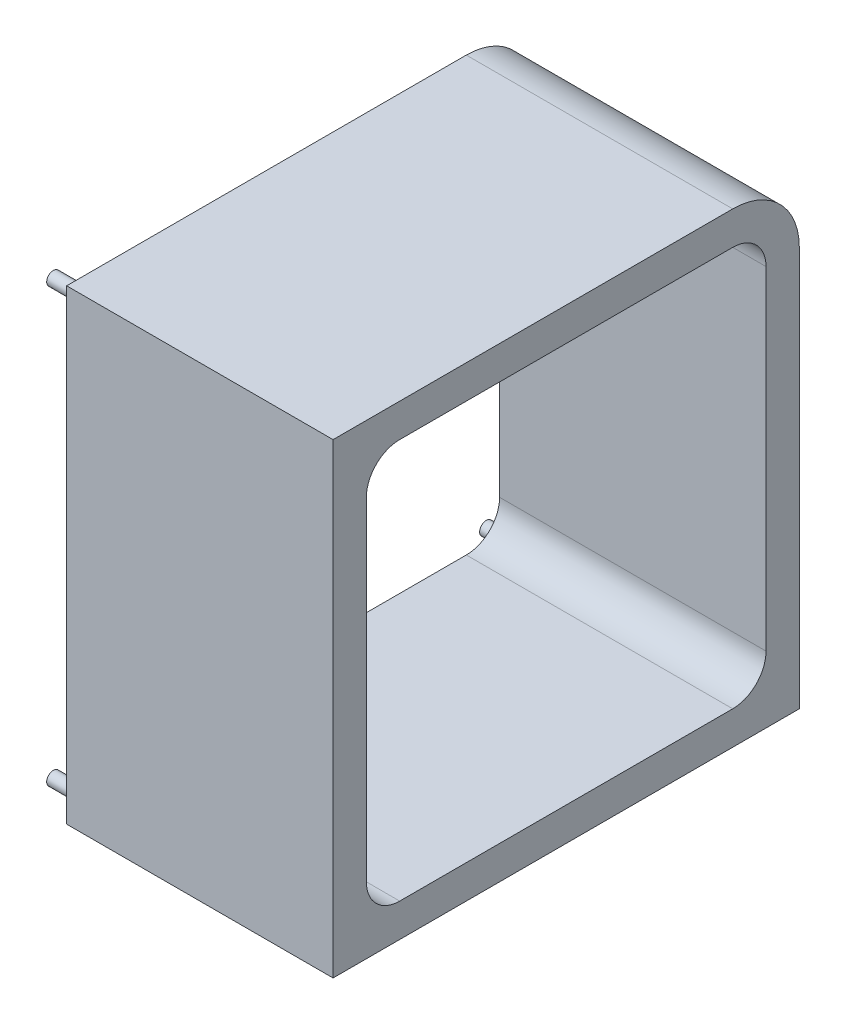
ISO-10303-21;
HEADER;
FILE_DESCRIPTION(('STEP AP214'),'2;1');
FILE_NAME('part.step','',(''),(''),'','','');
FILE_SCHEMA(('AUTOMOTIVE_DESIGN { 1 0 10303 214 1 1 1 1 }'));
ENDSEC;
DATA;
#1=APPLICATION_CONTEXT('core data for automotive mechanical design processes');
#2=APPLICATION_PROTOCOL_DEFINITION('international standard','automotive_design',2000,#1);
#3=PRODUCT_CONTEXT('',#1,'mechanical');
#4=PRODUCT('Part','Part','',(#3));
#5=PRODUCT_RELATED_PRODUCT_CATEGORY('part','',(#4));
#6=PRODUCT_DEFINITION_FORMATION('','',#4);
#7=PRODUCT_DEFINITION_CONTEXT('part definition',#1,'design');
#8=PRODUCT_DEFINITION('design','',#6,#7);
#9=PRODUCT_DEFINITION_SHAPE('','',#8);
#10=(LENGTH_UNIT() NAMED_UNIT(*) SI_UNIT(.MILLI.,.METRE.));
#11=(NAMED_UNIT(*) PLANE_ANGLE_UNIT() SI_UNIT($,.RADIAN.));
#12=(NAMED_UNIT(*) SI_UNIT($,.STERADIAN.) SOLID_ANGLE_UNIT());
#13=UNCERTAINTY_MEASURE_WITH_UNIT(LENGTH_MEASURE(1.E-05),#10,'distance_accuracy_value','');
#14=(GEOMETRIC_REPRESENTATION_CONTEXT(3) GLOBAL_UNCERTAINTY_ASSIGNED_CONTEXT((#13)) GLOBAL_UNIT_ASSIGNED_CONTEXT((#10,
#11,#12)) REPRESENTATION_CONTEXT('',''));
#15=CARTESIAN_POINT('',(0.,0.,0.));
#16=DIRECTION('',(0.,0.,1.));
#17=DIRECTION('',(1.,0.,0.));
#18=AXIS2_PLACEMENT_3D('',#15,#16,#17);
#19=CARTESIAN_POINT('',(80.,120.,-120.));
#20=DIRECTION('',(-1.,0.,0.));
#21=DIRECTION('',(0.,0.,1.));
#22=AXIS2_PLACEMENT_3D('',#19,#20,#21);
#23=PLANE('',#22);
#24=DIRECTION('',(0.,-1.,0.));
#25=VECTOR('',#24,1.);
#26=CARTESIAN_POINT('',(80.,0.,0.));
#27=LINE('',#26,#25);
#28=CARTESIAN_POINT('',(80.,140.,0.));
#29=VERTEX_POINT('',#28);
#30=CARTESIAN_POINT('',(80.,0.,0.));
#31=VERTEX_POINT('',#30);
#32=EDGE_CURVE('E226',#29,#31,#27,.T.);
#33=ORIENTED_EDGE('',*,*,#32,.T.);
#34=DIRECTION('',(0.,0.,-1.));
#35=VECTOR('',#34,1.);
#36=CARTESIAN_POINT('',(80.,0.,0.));
#37=LINE('',#36,#35);
#38=CARTESIAN_POINT('',(80.,0.,-140.));
#39=VERTEX_POINT('',#38);
#40=EDGE_CURVE('E230',#31,#39,#37,.T.);
#41=ORIENTED_EDGE('',*,*,#40,.T.);
#42=DIRECTION('',(0.,1.,0.));
#43=VECTOR('',#42,1.);
#44=CARTESIAN_POINT('',(80.,0.,-140.));
#45=LINE('',#44,#43);
#46=CARTESIAN_POINT('',(80.,120.,-140.));
#47=VERTEX_POINT('',#46);
#48=EDGE_CURVE('E234',#39,#47,#45,.T.);
#49=ORIENTED_EDGE('',*,*,#48,.T.);
#50=CARTESIAN_POINT('',(80.,120.,-120.));
#51=DIRECTION('',(1.,0.,0.));
#52=DIRECTION('',(0.,0.,1.));
#53=AXIS2_PLACEMENT_3D('',#50,#51,#52);
#54=CIRCLE('',#53,20.);
#55=CARTESIAN_POINT('',(80.,140.,-120.));
#56=VERTEX_POINT('',#55);
#57=EDGE_CURVE('E237',#47,#56,#54,.T.);
#58=ORIENTED_EDGE('',*,*,#57,.T.);
#59=DIRECTION('',(0.,0.,1.));
#60=VECTOR('',#59,1.);
#61=CARTESIAN_POINT('',(80.,140.,0.));
#62=LINE('',#61,#60);
#63=EDGE_CURVE('E240',#56,#29,#62,.T.);
#64=ORIENTED_EDGE('',*,*,#63,.T.);
#65=EDGE_LOOP('',(#33,#41,#49,#58,#64));
#66=FACE_BOUND('',#65,.T.);
#67=CARTESIAN_POINT('',(80.,20.,-120.));
#68=DIRECTION('',(1.,0.,0.));
#69=DIRECTION('',(0.,0.,-1.));
#70=AXIS2_PLACEMENT_3D('',#67,#68,#69);
#71=CIRCLE('',#70,10.);
#72=CARTESIAN_POINT('',(80.,10.,-120.));
#73=VERTEX_POINT('',#72);
#74=CARTESIAN_POINT('',(80.,20.0000000000001,-130.));
#75=VERTEX_POINT('',#74);
#76=EDGE_CURVE('E135',#73,#75,#71,.T.);
#77=ORIENTED_EDGE('',*,*,#76,.F.);
#78=DIRECTION('',(0.,0.,-1.));
#79=VECTOR('',#78,1.);
#80=CARTESIAN_POINT('',(80.,10.,-20.0000000000001));
#81=LINE('',#80,#79);
#82=CARTESIAN_POINT('',(80.,9.99999999999999,-20.0000000000001));
#83=VERTEX_POINT('',#82);
#84=EDGE_CURVE('E177',#83,#73,#81,.T.);
#85=ORIENTED_EDGE('',*,*,#84,.F.);
#86=CARTESIAN_POINT('',(80.,20.,-20.));
#87=DIRECTION('',(1.,0.,0.));
#88=DIRECTION('',(0.,0.,1.));
#89=AXIS2_PLACEMENT_3D('',#86,#87,#88);
#90=CIRCLE('',#89,10.);
#91=CARTESIAN_POINT('',(80.,20.,-10.));
#92=VERTEX_POINT('',#91);
#93=EDGE_CURVE('E174',#92,#83,#90,.T.);
#94=ORIENTED_EDGE('',*,*,#93,.F.);
#95=DIRECTION('',(0.,-1.,0.));
#96=VECTOR('',#95,1.);
#97=CARTESIAN_POINT('',(80.,120.,-10.));
#98=LINE('',#97,#96);
#99=CARTESIAN_POINT('',(80.,120.,-10.));
#100=VERTEX_POINT('',#99);
#101=EDGE_CURVE('E171',#100,#92,#98,.T.);
#102=ORIENTED_EDGE('',*,*,#101,.F.);
#103=CARTESIAN_POINT('',(80.,120.,-20.));
#104=DIRECTION('',(1.,0.,0.));
#105=DIRECTION('',(0.,0.,1.));
#106=AXIS2_PLACEMENT_3D('',#103,#104,#105);
#107=CIRCLE('',#106,10.);
#108=CARTESIAN_POINT('',(80.,130.,-20.0000000000001));
#109=VERTEX_POINT('',#108);
#110=EDGE_CURVE('E168',#109,#100,#107,.T.);
#111=ORIENTED_EDGE('',*,*,#110,.F.);
#112=DIRECTION('',(0.,0.,1.));
#113=VECTOR('',#112,1.);
#114=CARTESIAN_POINT('',(80.,130.,-20.0000000000001));
#115=LINE('',#114,#113);
#116=CARTESIAN_POINT('',(80.,130.,-120.));
#117=VERTEX_POINT('',#116);
#118=EDGE_CURVE('E162',#117,#109,#115,.T.);
#119=ORIENTED_EDGE('',*,*,#118,.F.);
#120=CARTESIAN_POINT('',(80.,120.,-120.));
#121=DIRECTION('',(1.,0.,0.));
#122=DIRECTION('',(0.,0.,-1.));
#123=AXIS2_PLACEMENT_3D('',#120,#121,#122);
#124=CIRCLE('',#123,9.99999999999999);
#125=CARTESIAN_POINT('',(80.,120.,-130.));
#126=VERTEX_POINT('',#125);
#127=EDGE_CURVE('E158',#126,#117,#124,.T.);
#128=ORIENTED_EDGE('',*,*,#127,.F.);
#129=DIRECTION('',(0.,1.,0.));
#130=VECTOR('',#129,1.);
#131=CARTESIAN_POINT('',(80.,120.,-130.));
#132=LINE('',#131,#130);
#133=EDGE_CURVE('E144',#75,#126,#132,.T.);
#134=ORIENTED_EDGE('',*,*,#133,.F.);
#135=EDGE_LOOP('',(#77,#85,#94,#102,#111,#119,#128,#134));
#136=FACE_BOUND('',#135,.T.);
#137=ADVANCED_FACE('F39',(#66,#136),#23,.F.);
#138=CARTESIAN_POINT('',(0.,120.,-120.));
#139=DIRECTION('',(-1.,0.,0.));
#140=DIRECTION('',(0.,0.,1.));
#141=AXIS2_PLACEMENT_3D('',#138,#139,#140);
#142=PLANE('',#141);
#143=CARTESIAN_POINT('',(0.,5.,-5.));
#144=DIRECTION('',(-1.,0.,0.));
#145=DIRECTION('',(0.,0.,1.));
#146=AXIS2_PLACEMENT_3D('',#143,#144,#145);
#147=CIRCLE('',#146,2.);
#148=CARTESIAN_POINT('',(0.,5.,-3.));
#149=VERTEX_POINT('',#148);
#150=EDGE_CURVE('E491',#149,#149,#147,.T.);
#151=ORIENTED_EDGE('',*,*,#150,.F.);
#152=EDGE_LOOP('',(#151));
#153=FACE_BOUND('',#152,.T.);
#154=CARTESIAN_POINT('',(0.,5.,-135.));
#155=DIRECTION('',(-1.,0.,0.));
#156=DIRECTION('',(0.,0.,1.));
#157=AXIS2_PLACEMENT_3D('',#154,#155,#156);
#158=CIRCLE('',#157,2.);
#159=CARTESIAN_POINT('',(0.,5.,-133.));
#160=VERTEX_POINT('',#159);
#161=EDGE_CURVE('E490',#160,#160,#158,.T.);
#162=ORIENTED_EDGE('',*,*,#161,.F.);
#163=EDGE_LOOP('',(#162));
#164=FACE_BOUND('',#163,.T.);
#165=CARTESIAN_POINT('',(0.,135.,-5.));
#166=DIRECTION('',(-1.,0.,0.));
#167=DIRECTION('',(0.,0.,1.));
#168=AXIS2_PLACEMENT_3D('',#165,#166,#167);
#169=CIRCLE('',#168,2.);
#170=CARTESIAN_POINT('',(0.,135.,-3.));
#171=VERTEX_POINT('',#170);
#172=EDGE_CURVE('E503',#171,#171,#169,.T.);
#173=ORIENTED_EDGE('',*,*,#172,.F.);
#174=EDGE_LOOP('',(#173));
#175=FACE_BOUND('',#174,.T.);
#176=DIRECTION('',(0.,-1.,0.));
#177=VECTOR('',#176,1.);
#178=CARTESIAN_POINT('',(0.,0.,0.));
#179=LINE('',#178,#177);
#180=CARTESIAN_POINT('',(0.,140.,0.));
#181=VERTEX_POINT('',#180);
#182=CARTESIAN_POINT('',(0.,0.,0.));
#183=VERTEX_POINT('',#182);
#184=EDGE_CURVE('E153',#181,#183,#179,.T.);
#185=ORIENTED_EDGE('',*,*,#184,.F.);
#186=DIRECTION('',(0.,0.,1.));
#187=VECTOR('',#186,1.);
#188=CARTESIAN_POINT('',(0.,140.,0.));
#189=LINE('',#188,#187);
#190=CARTESIAN_POINT('',(0.,140.,-120.));
#191=VERTEX_POINT('',#190);
#192=EDGE_CURVE('E231',#191,#181,#189,.T.);
#193=ORIENTED_EDGE('',*,*,#192,.F.);
#194=CARTESIAN_POINT('',(0.,120.,-120.));
#195=DIRECTION('',(1.,0.,0.));
#196=DIRECTION('',(0.,0.,1.));
#197=AXIS2_PLACEMENT_3D('',#194,#195,#196);
#198=CIRCLE('',#197,20.);
#199=CARTESIAN_POINT('',(0.,120.,-140.));
#200=VERTEX_POINT('',#199);
#201=EDGE_CURVE('E253',#200,#191,#198,.T.);
#202=ORIENTED_EDGE('',*,*,#201,.F.);
#203=DIRECTION('',(0.,1.,0.));
#204=VECTOR('',#203,1.);
#205=CARTESIAN_POINT('',(0.,0.,-140.));
#206=LINE('',#205,#204);
#207=CARTESIAN_POINT('',(0.,0.,-140.));
#208=VERTEX_POINT('',#207);
#209=EDGE_CURVE('E250',#208,#200,#206,.T.);
#210=ORIENTED_EDGE('',*,*,#209,.F.);
#211=DIRECTION('',(0.,0.,-1.));
#212=VECTOR('',#211,1.);
#213=CARTESIAN_POINT('',(0.,0.,0.));
#214=LINE('',#213,#212);
#215=EDGE_CURVE('E247',#183,#208,#214,.T.);
#216=ORIENTED_EDGE('',*,*,#215,.F.);
#217=EDGE_LOOP('',(#185,#193,#202,#210,#216));
#218=FACE_BOUND('',#217,.T.);
#219=DIRECTION('',(0.,0.,-1.));
#220=VECTOR('',#219,1.);
#221=CARTESIAN_POINT('',(0.,10.,-20.0000000000001));
#222=LINE('',#221,#220);
#223=CARTESIAN_POINT('',(0.,10.,-20.0000000000001));
#224=VERTEX_POINT('',#223);
#225=CARTESIAN_POINT('',(0.,9.99999999999999,-120.));
#226=VERTEX_POINT('',#225);
#227=EDGE_CURVE('E145',#224,#226,#222,.T.);
#228=ORIENTED_EDGE('',*,*,#227,.T.);
#229=CARTESIAN_POINT('',(0.,20.,-120.));
#230=DIRECTION('',(1.,0.,0.));
#231=DIRECTION('',(0.,0.,-1.));
#232=AXIS2_PLACEMENT_3D('',#229,#230,#231);
#233=CIRCLE('',#232,10.);
#234=CARTESIAN_POINT('',(0.,20.0000000000001,-130.));
#235=VERTEX_POINT('',#234);
#236=EDGE_CURVE('E63',#226,#235,#233,.T.);
#237=ORIENTED_EDGE('',*,*,#236,.T.);
#238=DIRECTION('',(0.,1.,0.));
#239=VECTOR('',#238,1.);
#240=CARTESIAN_POINT('',(0.,120.,-130.));
#241=LINE('',#240,#239);
#242=CARTESIAN_POINT('',(0.,120.,-130.));
#243=VERTEX_POINT('',#242);
#244=EDGE_CURVE('E151',#235,#243,#241,.T.);
#245=ORIENTED_EDGE('',*,*,#244,.T.);
#246=CARTESIAN_POINT('',(0.,120.,-120.));
#247=DIRECTION('',(1.,0.,0.));
#248=DIRECTION('',(0.,0.,-1.));
#249=AXIS2_PLACEMENT_3D('',#246,#247,#248);
#250=CIRCLE('',#249,9.99999999999999);
#251=CARTESIAN_POINT('',(0.,130.,-120.));
#252=VERTEX_POINT('',#251);
#253=EDGE_CURVE('E185',#243,#252,#250,.T.);
#254=ORIENTED_EDGE('',*,*,#253,.T.);
#255=DIRECTION('',(0.,0.,1.));
#256=VECTOR('',#255,1.);
#257=CARTESIAN_POINT('',(0.,130.,-20.0000000000001));
#258=LINE('',#257,#256);
#259=CARTESIAN_POINT('',(0.,130.,-20.0000000000001));
#260=VERTEX_POINT('',#259);
#261=EDGE_CURVE('E189',#252,#260,#258,.T.);
#262=ORIENTED_EDGE('',*,*,#261,.T.);
#263=CARTESIAN_POINT('',(0.,120.,-20.));
#264=DIRECTION('',(1.,0.,0.));
#265=DIRECTION('',(0.,0.,1.));
#266=AXIS2_PLACEMENT_3D('',#263,#264,#265);
#267=CIRCLE('',#266,10.);
#268=CARTESIAN_POINT('',(0.,120.,-10.));
#269=VERTEX_POINT('',#268);
#270=EDGE_CURVE('E193',#260,#269,#267,.T.);
#271=ORIENTED_EDGE('',*,*,#270,.T.);
#272=DIRECTION('',(0.,-1.,0.));
#273=VECTOR('',#272,1.);
#274=CARTESIAN_POINT('',(0.,120.,-10.));
#275=LINE('',#274,#273);
#276=CARTESIAN_POINT('',(0.,20.,-10.));
#277=VERTEX_POINT('',#276);
#278=EDGE_CURVE('E197',#269,#277,#275,.T.);
#279=ORIENTED_EDGE('',*,*,#278,.T.);
#280=CARTESIAN_POINT('',(0.,20.,-20.));
#281=DIRECTION('',(1.,0.,0.));
#282=DIRECTION('',(0.,0.,1.));
#283=AXIS2_PLACEMENT_3D('',#280,#281,#282);
#284=CIRCLE('',#283,10.);
#285=EDGE_CURVE('E201',#277,#224,#284,.T.);
#286=ORIENTED_EDGE('',*,*,#285,.T.);
#287=EDGE_LOOP('',(#228,#237,#245,#254,#262,#271,#279,#286));
#288=FACE_BOUND('',#287,.T.);
#289=ADVANCED_FACE('F280',(#153,#164,#175,#218,#288),#142,.T.);
#290=CARTESIAN_POINT('',(80.,0.,0.));
#291=DIRECTION('',(0.,0.,-1.));
#292=DIRECTION('',(-1.,0.,0.));
#293=AXIS2_PLACEMENT_3D('',#290,#291,#292);
#294=PLANE('',#293);
#295=ORIENTED_EDGE('',*,*,#184,.T.);
#296=DIRECTION('',(-1.,0.,0.));
#297=VECTOR('',#296,1.);
#298=CARTESIAN_POINT('',(80.,0.,0.));
#299=LINE('',#298,#297);
#300=EDGE_CURVE('E11',#31,#183,#299,.T.);
#301=ORIENTED_EDGE('',*,*,#300,.F.);
#302=ORIENTED_EDGE('',*,*,#32,.F.);
#303=DIRECTION('',(-1.,0.,0.));
#304=VECTOR('',#303,1.);
#305=CARTESIAN_POINT('',(80.,140.,0.));
#306=LINE('',#305,#304);
#307=EDGE_CURVE('E243',#29,#181,#306,.T.);
#308=ORIENTED_EDGE('',*,*,#307,.T.);
#309=EDGE_LOOP('',(#295,#301,#302,#308));
#310=FACE_BOUND('',#309,.T.);
#311=ADVANCED_FACE('F41',(#310),#294,.F.);
#312=CARTESIAN_POINT('',(80.,0.,0.));
#313=DIRECTION('',(0.,1.,0.));
#314=DIRECTION('',(0.,0.,1.));
#315=AXIS2_PLACEMENT_3D('',#312,#313,#314);
#316=PLANE('',#315);
#317=ORIENTED_EDGE('',*,*,#215,.T.);
#318=DIRECTION('',(-1.,0.,0.));
#319=VECTOR('',#318,1.);
#320=CARTESIAN_POINT('',(80.,0.,-140.));
#321=LINE('',#320,#319);
#322=EDGE_CURVE('E48',#39,#208,#321,.T.);
#323=ORIENTED_EDGE('',*,*,#322,.F.);
#324=ORIENTED_EDGE('',*,*,#40,.F.);
#325=ORIENTED_EDGE('',*,*,#300,.T.);
#326=EDGE_LOOP('',(#317,#323,#324,#325));
#327=FACE_BOUND('',#326,.T.);
#328=ADVANCED_FACE('F294',(#327),#316,.F.);
#329=CARTESIAN_POINT('',(80.,0.,-140.));
#330=DIRECTION('',(0.,0.,1.));
#331=DIRECTION('',(1.,0.,0.));
#332=AXIS2_PLACEMENT_3D('',#329,#330,#331);
#333=PLANE('',#332);
#334=ORIENTED_EDGE('',*,*,#209,.T.);
#335=DIRECTION('',(-1.,0.,0.));
#336=VECTOR('',#335,1.);
#337=CARTESIAN_POINT('',(80.,120.,-140.));
#338=LINE('',#337,#336);
#339=EDGE_CURVE('E265',#47,#200,#338,.T.);
#340=ORIENTED_EDGE('',*,*,#339,.F.);
#341=ORIENTED_EDGE('',*,*,#48,.F.);
#342=ORIENTED_EDGE('',*,*,#322,.T.);
#343=EDGE_LOOP('',(#334,#340,#341,#342));
#344=FACE_BOUND('',#343,.T.);
#345=ADVANCED_FACE('F274',(#344),#333,.F.);
#346=CARTESIAN_POINT('',(80.,120.,-120.));
#347=DIRECTION('',(-1.,0.,0.));
#348=DIRECTION('',(0.,0.,1.));
#349=AXIS2_PLACEMENT_3D('',#346,#347,#348);
#350=CYLINDRICAL_SURFACE('',#349,20.);
#351=ORIENTED_EDGE('',*,*,#201,.T.);
#352=DIRECTION('',(-1.,0.,0.));
#353=VECTOR('',#352,1.);
#354=CARTESIAN_POINT('',(80.,140.,-120.));
#355=LINE('',#354,#353);
#356=EDGE_CURVE('E261',#56,#191,#355,.T.);
#357=ORIENTED_EDGE('',*,*,#356,.F.);
#358=ORIENTED_EDGE('',*,*,#57,.F.);
#359=ORIENTED_EDGE('',*,*,#339,.T.);
#360=EDGE_LOOP('',(#351,#357,#358,#359));
#361=FACE_BOUND('',#360,.T.);
#362=ADVANCED_FACE('F285',(#361),#350,.T.);
#363=CARTESIAN_POINT('',(80.,140.,0.));
#364=DIRECTION('',(0.,-1.,0.));
#365=DIRECTION('',(0.,0.,-1.));
#366=AXIS2_PLACEMENT_3D('',#363,#364,#365);
#367=PLANE('',#366);
#368=ORIENTED_EDGE('',*,*,#192,.T.);
#369=ORIENTED_EDGE('',*,*,#307,.F.);
#370=ORIENTED_EDGE('',*,*,#63,.F.);
#371=ORIENTED_EDGE('',*,*,#356,.T.);
#372=EDGE_LOOP('',(#368,#369,#370,#371));
#373=FACE_BOUND('',#372,.T.);
#374=ADVANCED_FACE('F289',(#373),#367,.F.);
#375=CARTESIAN_POINT('',(80.,20.,-120.));
#376=DIRECTION('',(-1.,0.,0.));
#377=DIRECTION('',(0.,0.,1.));
#378=AXIS2_PLACEMENT_3D('',#375,#376,#377);
#379=CYLINDRICAL_SURFACE('',#378,10.);
#380=ORIENTED_EDGE('',*,*,#236,.F.);
#381=DIRECTION('',(-1.,0.,0.));
#382=VECTOR('',#381,1.);
#383=CARTESIAN_POINT('',(80.,10.,-120.));
#384=LINE('',#383,#382);
#385=EDGE_CURVE('E139',#73,#226,#384,.T.);
#386=ORIENTED_EDGE('',*,*,#385,.F.);
#387=ORIENTED_EDGE('',*,*,#76,.T.);
#388=DIRECTION('',(-1.,0.,0.));
#389=VECTOR('',#388,1.);
#390=CARTESIAN_POINT('',(80.,20.0000000000001,-130.));
#391=LINE('',#390,#389);
#392=EDGE_CURVE('E138',#75,#235,#391,.T.);
#393=ORIENTED_EDGE('',*,*,#392,.T.);
#394=EDGE_LOOP('',(#380,#386,#387,#393));
#395=FACE_BOUND('',#394,.T.);
#396=ADVANCED_FACE('F137',(#395),#379,.F.);
#397=CARTESIAN_POINT('',(80.,120.,-130.));
#398=DIRECTION('',(0.,0.,1.));
#399=DIRECTION('',(0.,-1.,0.));
#400=AXIS2_PLACEMENT_3D('',#397,#398,#399);
#401=PLANE('',#400);
#402=ORIENTED_EDGE('',*,*,#244,.F.);
#403=ORIENTED_EDGE('',*,*,#392,.F.);
#404=ORIENTED_EDGE('',*,*,#133,.T.);
#405=DIRECTION('',(-1.,0.,0.));
#406=VECTOR('',#405,1.);
#407=CARTESIAN_POINT('',(80.,120.,-130.));
#408=LINE('',#407,#406);
#409=EDGE_CURVE('E154',#126,#243,#408,.T.);
#410=ORIENTED_EDGE('',*,*,#409,.T.);
#411=EDGE_LOOP('',(#402,#403,#404,#410));
#412=FACE_BOUND('',#411,.T.);
#413=ADVANCED_FACE('F148',(#412),#401,.T.);
#414=CARTESIAN_POINT('',(80.,120.,-120.));
#415=DIRECTION('',(-1.,0.,0.));
#416=DIRECTION('',(0.,0.,1.));
#417=AXIS2_PLACEMENT_3D('',#414,#415,#416);
#418=CYLINDRICAL_SURFACE('',#417,9.99999999999999);
#419=ORIENTED_EDGE('',*,*,#253,.F.);
#420=ORIENTED_EDGE('',*,*,#409,.F.);
#421=ORIENTED_EDGE('',*,*,#127,.T.);
#422=DIRECTION('',(-1.,0.,0.));
#423=VECTOR('',#422,1.);
#424=CARTESIAN_POINT('',(80.,130.,-120.));
#425=LINE('',#424,#423);
#426=EDGE_CURVE('E221',#117,#252,#425,.T.);
#427=ORIENTED_EDGE('',*,*,#426,.T.);
#428=EDGE_LOOP('',(#419,#420,#421,#427));
#429=FACE_BOUND('',#428,.T.);
#430=ADVANCED_FACE('F338',(#429),#418,.F.);
#431=CARTESIAN_POINT('',(80.,130.,-20.0000000000001));
#432=DIRECTION('',(0.,-1.,0.));
#433=DIRECTION('',(0.,0.,-1.));
#434=AXIS2_PLACEMENT_3D('',#431,#432,#433);
#435=PLANE('',#434);
#436=ORIENTED_EDGE('',*,*,#261,.F.);
#437=ORIENTED_EDGE('',*,*,#426,.F.);
#438=ORIENTED_EDGE('',*,*,#118,.T.);
#439=DIRECTION('',(-1.,0.,0.));
#440=VECTOR('',#439,1.);
#441=CARTESIAN_POINT('',(80.,130.,-20.0000000000001));
#442=LINE('',#441,#440);
#443=EDGE_CURVE('E218',#109,#260,#442,.T.);
#444=ORIENTED_EDGE('',*,*,#443,.T.);
#445=EDGE_LOOP('',(#436,#437,#438,#444));
#446=FACE_BOUND('',#445,.T.);
#447=ADVANCED_FACE('F344',(#446),#435,.T.);
#448=CARTESIAN_POINT('',(80.,120.,-20.));
#449=DIRECTION('',(-1.,0.,0.));
#450=DIRECTION('',(0.,0.,1.));
#451=AXIS2_PLACEMENT_3D('',#448,#449,#450);
#452=CYLINDRICAL_SURFACE('',#451,10.);
#453=ORIENTED_EDGE('',*,*,#270,.F.);
#454=ORIENTED_EDGE('',*,*,#443,.F.);
#455=ORIENTED_EDGE('',*,*,#110,.T.);
#456=DIRECTION('',(-1.,0.,0.));
#457=VECTOR('',#456,1.);
#458=CARTESIAN_POINT('',(80.,120.,-10.));
#459=LINE('',#458,#457);
#460=EDGE_CURVE('E215',#100,#269,#459,.T.);
#461=ORIENTED_EDGE('',*,*,#460,.T.);
#462=EDGE_LOOP('',(#453,#454,#455,#461));
#463=FACE_BOUND('',#462,.T.);
#464=ADVANCED_FACE('F352',(#463),#452,.F.);
#465=CARTESIAN_POINT('',(80.,120.,-10.));
#466=DIRECTION('',(0.,0.,-1.));
#467=DIRECTION('',(0.,1.,0.));
#468=AXIS2_PLACEMENT_3D('',#465,#466,#467);
#469=PLANE('',#468);
#470=ORIENTED_EDGE('',*,*,#278,.F.);
#471=ORIENTED_EDGE('',*,*,#460,.F.);
#472=ORIENTED_EDGE('',*,*,#101,.T.);
#473=DIRECTION('',(-1.,0.,0.));
#474=VECTOR('',#473,1.);
#475=CARTESIAN_POINT('',(80.,20.,-10.));
#476=LINE('',#475,#474);
#477=EDGE_CURVE('E212',#92,#277,#476,.T.);
#478=ORIENTED_EDGE('',*,*,#477,.T.);
#479=EDGE_LOOP('',(#470,#471,#472,#478));
#480=FACE_BOUND('',#479,.T.);
#481=ADVANCED_FACE('F360',(#480),#469,.T.);
#482=CARTESIAN_POINT('',(80.,20.,-20.));
#483=DIRECTION('',(-1.,0.,0.));
#484=DIRECTION('',(0.,0.,1.));
#485=AXIS2_PLACEMENT_3D('',#482,#483,#484);
#486=CYLINDRICAL_SURFACE('',#485,10.);
#487=ORIENTED_EDGE('',*,*,#285,.F.);
#488=ORIENTED_EDGE('',*,*,#477,.F.);
#489=ORIENTED_EDGE('',*,*,#93,.T.);
#490=DIRECTION('',(-1.,0.,0.));
#491=VECTOR('',#490,1.);
#492=CARTESIAN_POINT('',(80.,10.,-20.0000000000001));
#493=LINE('',#492,#491);
#494=EDGE_CURVE('E55',#83,#224,#493,.T.);
#495=ORIENTED_EDGE('',*,*,#494,.T.);
#496=EDGE_LOOP('',(#487,#488,#489,#495));
#497=FACE_BOUND('',#496,.T.);
#498=ADVANCED_FACE('F368',(#497),#486,.F.);
#499=CARTESIAN_POINT('',(80.,10.,-20.0000000000001));
#500=DIRECTION('',(0.,1.,0.));
#501=DIRECTION('',(0.,0.,1.));
#502=AXIS2_PLACEMENT_3D('',#499,#500,#501);
#503=PLANE('',#502);
#504=ORIENTED_EDGE('',*,*,#227,.F.);
#505=ORIENTED_EDGE('',*,*,#494,.F.);
#506=ORIENTED_EDGE('',*,*,#84,.T.);
#507=ORIENTED_EDGE('',*,*,#385,.T.);
#508=EDGE_LOOP('',(#504,#505,#506,#507));
#509=FACE_BOUND('',#508,.T.);
#510=ADVANCED_FACE('F376',(#509),#503,.T.);
#511=CARTESIAN_POINT('',(-9.,135.,-5.));
#512=DIRECTION('',(1.,0.,0.));
#513=DIRECTION('',(0.,0.,-1.));
#514=AXIS2_PLACEMENT_3D('',#511,#512,#513);
#515=CYLINDRICAL_SURFACE('',#514,2.);
#516=CARTESIAN_POINT('',(-9.,135.,-5.));
#517=DIRECTION('',(-1.,0.,0.));
#518=DIRECTION('',(0.,0.,1.));
#519=AXIS2_PLACEMENT_3D('',#516,#517,#518);
#520=CIRCLE('',#519,2.);
#521=CARTESIAN_POINT('',(-9.,135.,-3.));
#522=VERTEX_POINT('',#521);
#523=EDGE_CURVE('E182',#522,#522,#520,.T.);
#524=ORIENTED_EDGE('',*,*,#523,.F.);
#525=EDGE_LOOP('',(#524));
#526=FACE_BOUND('',#525,.T.);
#527=ORIENTED_EDGE('',*,*,#172,.T.);
#528=EDGE_LOOP('',(#527));
#529=FACE_BOUND('',#528,.T.);
#530=ADVANCED_FACE('F384',(#526,#529),#515,.T.);
#531=CARTESIAN_POINT('',(-9.,135.,-5.));
#532=DIRECTION('',(-1.,0.,0.));
#533=DIRECTION('',(0.,0.,1.));
#534=AXIS2_PLACEMENT_3D('',#531,#532,#533);
#535=PLANE('',#534);
#536=ORIENTED_EDGE('',*,*,#523,.T.);
#537=EDGE_LOOP('',(#536));
#538=FACE_BOUND('',#537,.T.);
#539=ADVANCED_FACE('F392',(#538),#535,.T.);
#540=CARTESIAN_POINT('',(-9.,5.,-135.));
#541=DIRECTION('',(1.,0.,0.));
#542=DIRECTION('',(0.,0.,-1.));
#543=AXIS2_PLACEMENT_3D('',#540,#541,#542);
#544=CYLINDRICAL_SURFACE('',#543,2.);
#545=CARTESIAN_POINT('',(-9.,5.,-135.));
#546=DIRECTION('',(-1.,0.,0.));
#547=DIRECTION('',(0.,0.,1.));
#548=AXIS2_PLACEMENT_3D('',#545,#546,#547);
#549=CIRCLE('',#548,2.);
#550=CARTESIAN_POINT('',(-9.,5.,-133.));
#551=VERTEX_POINT('',#550);
#552=EDGE_CURVE('E496',#551,#551,#549,.T.);
#553=ORIENTED_EDGE('',*,*,#552,.F.);
#554=EDGE_LOOP('',(#553));
#555=FACE_BOUND('',#554,.T.);
#556=ORIENTED_EDGE('',*,*,#161,.T.);
#557=EDGE_LOOP('',(#556));
#558=FACE_BOUND('',#557,.T.);
#559=ADVANCED_FACE('F400',(#555,#558),#544,.T.);
#560=CARTESIAN_POINT('',(-9.,5.,-135.));
#561=DIRECTION('',(-1.,0.,0.));
#562=DIRECTION('',(0.,0.,1.));
#563=AXIS2_PLACEMENT_3D('',#560,#561,#562);
#564=PLANE('',#563);
#565=ORIENTED_EDGE('',*,*,#552,.T.);
#566=EDGE_LOOP('',(#565));
#567=FACE_BOUND('',#566,.T.);
#568=ADVANCED_FACE('F408',(#567),#564,.T.);
#569=CARTESIAN_POINT('',(-9.,5.,-5.));
#570=DIRECTION('',(1.,0.,0.));
#571=DIRECTION('',(0.,0.,-1.));
#572=AXIS2_PLACEMENT_3D('',#569,#570,#571);
#573=CYLINDRICAL_SURFACE('',#572,2.);
#574=CARTESIAN_POINT('',(-9.,5.,-5.));
#575=DIRECTION('',(-1.,0.,0.));
#576=DIRECTION('',(0.,0.,1.));
#577=AXIS2_PLACEMENT_3D('',#574,#575,#576);
#578=CIRCLE('',#577,2.);
#579=CARTESIAN_POINT('',(-9.,5.,-3.));
#580=VERTEX_POINT('',#579);
#581=EDGE_CURVE('E488',#580,#580,#578,.T.);
#582=ORIENTED_EDGE('',*,*,#581,.F.);
#583=EDGE_LOOP('',(#582));
#584=FACE_BOUND('',#583,.T.);
#585=ORIENTED_EDGE('',*,*,#150,.T.);
#586=EDGE_LOOP('',(#585));
#587=FACE_BOUND('',#586,.T.);
#588=ADVANCED_FACE('F416',(#584,#587),#573,.T.);
#589=CARTESIAN_POINT('',(-9.,5.,-5.));
#590=DIRECTION('',(-1.,0.,0.));
#591=DIRECTION('',(0.,0.,1.));
#592=AXIS2_PLACEMENT_3D('',#589,#590,#591);
#593=PLANE('',#592);
#594=ORIENTED_EDGE('',*,*,#581,.T.);
#595=EDGE_LOOP('',(#594));
#596=FACE_BOUND('',#595,.T.);
#597=ADVANCED_FACE('F424',(#596),#593,.T.);
#598=CLOSED_SHELL('',(#137,#289,#311,#328,#345,#362,#374,#396,#413,#430,#447,#464,#481,#498,
#510,#530,#539,#559,#568,#588,#597));
#599=MANIFOLD_SOLID_BREP('B2',#598);
#600=ADVANCED_BREP_SHAPE_REPRESENTATION('',(#18,#599),#14);
#601=SHAPE_DEFINITION_REPRESENTATION(#9,#600);
ENDSEC;
END-ISO-10303-21;
